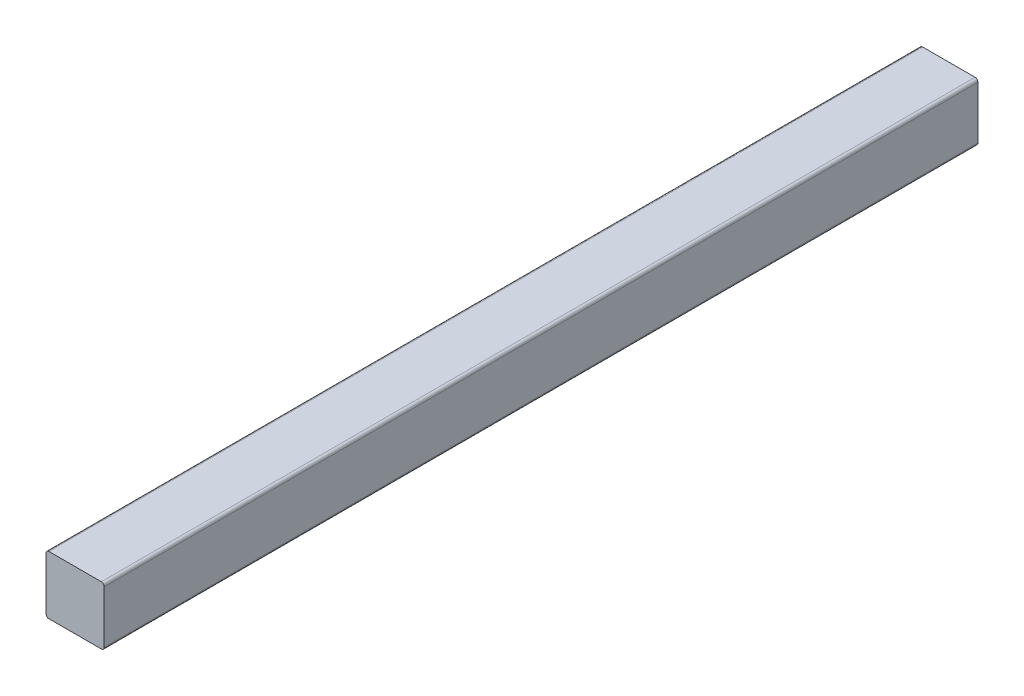
ISO-10303-21;
HEADER;
FILE_DESCRIPTION(('STEP AP214'),'2;1');
FILE_NAME('part.step','',(''),(''),'','','');
FILE_SCHEMA(('AUTOMOTIVE_DESIGN { 1 0 10303 214 1 1 1 1 }'));
ENDSEC;
DATA;
#1=APPLICATION_CONTEXT('core data for automotive mechanical design processes');
#2=APPLICATION_PROTOCOL_DEFINITION('international standard','automotive_design',2000,#1);
#3=PRODUCT_CONTEXT('',#1,'mechanical');
#4=PRODUCT('Part','Part','',(#3));
#5=PRODUCT_RELATED_PRODUCT_CATEGORY('part','',(#4));
#6=PRODUCT_DEFINITION_FORMATION('','',#4);
#7=PRODUCT_DEFINITION_CONTEXT('part definition',#1,'design');
#8=PRODUCT_DEFINITION('design','',#6,#7);
#9=PRODUCT_DEFINITION_SHAPE('','',#8);
#10=(LENGTH_UNIT() NAMED_UNIT(*) SI_UNIT(.MILLI.,.METRE.));
#11=(NAMED_UNIT(*) PLANE_ANGLE_UNIT() SI_UNIT($,.RADIAN.));
#12=(NAMED_UNIT(*) SI_UNIT($,.STERADIAN.) SOLID_ANGLE_UNIT());
#13=UNCERTAINTY_MEASURE_WITH_UNIT(LENGTH_MEASURE(1.E-05),#10,'distance_accuracy_value','');
#14=(GEOMETRIC_REPRESENTATION_CONTEXT(3) GLOBAL_UNCERTAINTY_ASSIGNED_CONTEXT((#13)) GLOBAL_UNIT_ASSIGNED_CONTEXT((#10,
#11,#12)) REPRESENTATION_CONTEXT('',''));
#15=CARTESIAN_POINT('',(0.,0.,0.));
#16=DIRECTION('',(0.,0.,1.));
#17=DIRECTION('',(1.,0.,0.));
#18=AXIS2_PLACEMENT_3D('',#15,#16,#17);
#19=CARTESIAN_POINT('',(19.,1.,300.));
#20=DIRECTION('',(0.,0.,-1.));
#21=DIRECTION('',(-1.,0.,0.));
#22=AXIS2_PLACEMENT_3D('',#19,#20,#21);
#23=CYLINDRICAL_SURFACE('',#22,1.);
#24=CARTESIAN_POINT('',(19.,1.,0.));
#25=DIRECTION('',(0.,0.,1.));
#26=DIRECTION('',(1.,0.,0.));
#27=AXIS2_PLACEMENT_3D('',#24,#25,#26);
#28=CIRCLE('',#27,1.);
#29=CARTESIAN_POINT('',(19.,0.,0.));
#30=VERTEX_POINT('',#29);
#31=CARTESIAN_POINT('',(20.,1.00000000000001,0.));
#32=VERTEX_POINT('',#31);
#33=EDGE_CURVE('E129',#30,#32,#28,.T.);
#34=ORIENTED_EDGE('',*,*,#33,.T.);
#35=DIRECTION('',(0.,0.,-1.));
#36=VECTOR('',#35,1.);
#37=CARTESIAN_POINT('',(20.,1.00000000000001,300.));
#38=LINE('',#37,#36);
#39=CARTESIAN_POINT('',(20.,1.00000000000001,300.));
#40=VERTEX_POINT('',#39);
#41=EDGE_CURVE('E11',#40,#32,#38,.T.);
#42=ORIENTED_EDGE('',*,*,#41,.F.);
#43=CARTESIAN_POINT('',(19.,1.,300.));
#44=DIRECTION('',(0.,0.,1.));
#45=DIRECTION('',(1.,0.,0.));
#46=AXIS2_PLACEMENT_3D('',#43,#44,#45);
#47=CIRCLE('',#46,1.);
#48=CARTESIAN_POINT('',(19.,0.,300.));
#49=VERTEX_POINT('',#48);
#50=EDGE_CURVE('E143',#49,#40,#47,.T.);
#51=ORIENTED_EDGE('',*,*,#50,.F.);
#52=DIRECTION('',(0.,0.,-1.));
#53=VECTOR('',#52,1.);
#54=CARTESIAN_POINT('',(19.,0.,300.));
#55=LINE('',#54,#53);
#56=EDGE_CURVE('E125',#49,#30,#55,.T.);
#57=ORIENTED_EDGE('',*,*,#56,.T.);
#58=EDGE_LOOP('',(#34,#42,#51,#57));
#59=FACE_BOUND('',#58,.T.);
#60=ADVANCED_FACE('F33',(#59),#23,.T.);
#61=CARTESIAN_POINT('',(20.,1.00000000000001,300.));
#62=DIRECTION('',(-1.,0.,0.));
#63=DIRECTION('',(0.,0.,1.));
#64=AXIS2_PLACEMENT_3D('',#61,#62,#63);
#65=PLANE('',#64);
#66=DIRECTION('',(0.,1.,0.));
#67=VECTOR('',#66,1.);
#68=CARTESIAN_POINT('',(20.,1.00000000000001,0.));
#69=LINE('',#68,#67);
#70=CARTESIAN_POINT('',(20.,19.,0.));
#71=VERTEX_POINT('',#70);
#72=EDGE_CURVE('E132',#32,#71,#69,.T.);
#73=ORIENTED_EDGE('',*,*,#72,.T.);
#74=DIRECTION('',(0.,0.,-1.));
#75=VECTOR('',#74,1.);
#76=CARTESIAN_POINT('',(20.,19.,300.));
#77=LINE('',#76,#75);
#78=CARTESIAN_POINT('',(20.,19.,300.));
#79=VERTEX_POINT('',#78);
#80=EDGE_CURVE('E41',#79,#71,#77,.T.);
#81=ORIENTED_EDGE('',*,*,#80,.F.);
#82=DIRECTION('',(0.,1.,0.));
#83=VECTOR('',#82,1.);
#84=CARTESIAN_POINT('',(20.,1.00000000000001,300.));
#85=LINE('',#84,#83);
#86=EDGE_CURVE('E92',#40,#79,#85,.T.);
#87=ORIENTED_EDGE('',*,*,#86,.F.);
#88=ORIENTED_EDGE('',*,*,#41,.T.);
#89=EDGE_LOOP('',(#73,#81,#87,#88));
#90=FACE_BOUND('',#89,.T.);
#91=ADVANCED_FACE('F178',(#90),#65,.F.);
#92=CARTESIAN_POINT('',(19.,19.,300.));
#93=DIRECTION('',(0.,0.,-1.));
#94=DIRECTION('',(-1.,0.,0.));
#95=AXIS2_PLACEMENT_3D('',#92,#93,#94);
#96=CYLINDRICAL_SURFACE('',#95,1.);
#97=CARTESIAN_POINT('',(19.,19.,0.));
#98=DIRECTION('',(0.,0.,1.));
#99=DIRECTION('',(-1.,0.,0.));
#100=AXIS2_PLACEMENT_3D('',#97,#98,#99);
#101=CIRCLE('',#100,1.);
#102=CARTESIAN_POINT('',(19.,20.,0.));
#103=VERTEX_POINT('',#102);
#104=EDGE_CURVE('E134',#71,#103,#101,.T.);
#105=ORIENTED_EDGE('',*,*,#104,.T.);
#106=DIRECTION('',(0.,0.,-1.));
#107=VECTOR('',#106,1.);
#108=CARTESIAN_POINT('',(19.,20.,300.));
#109=LINE('',#108,#107);
#110=CARTESIAN_POINT('',(19.,20.,300.));
#111=VERTEX_POINT('',#110);
#112=EDGE_CURVE('E150',#111,#103,#109,.T.);
#113=ORIENTED_EDGE('',*,*,#112,.F.);
#114=CARTESIAN_POINT('',(19.,19.,300.));
#115=DIRECTION('',(0.,0.,1.));
#116=DIRECTION('',(-1.,0.,0.));
#117=AXIS2_PLACEMENT_3D('',#114,#115,#116);
#118=CIRCLE('',#117,1.);
#119=EDGE_CURVE('E158',#79,#111,#118,.T.);
#120=ORIENTED_EDGE('',*,*,#119,.F.);
#121=ORIENTED_EDGE('',*,*,#80,.T.);
#122=EDGE_LOOP('',(#105,#113,#120,#121));
#123=FACE_BOUND('',#122,.T.);
#124=ADVANCED_FACE('F156',(#123),#96,.T.);
#125=CARTESIAN_POINT('',(1.00000000000001,20.,300.));
#126=DIRECTION('',(0.,-1.,0.));
#127=DIRECTION('',(0.,0.,-1.));
#128=AXIS2_PLACEMENT_3D('',#125,#126,#127);
#129=PLANE('',#128);
#130=DIRECTION('',(-1.,0.,0.));
#131=VECTOR('',#130,1.);
#132=CARTESIAN_POINT('',(1.00000000000001,20.,0.));
#133=LINE('',#132,#131);
#134=CARTESIAN_POINT('',(1.00000000000001,20.,0.));
#135=VERTEX_POINT('',#134);
#136=EDGE_CURVE('E136',#103,#135,#133,.T.);
#137=ORIENTED_EDGE('',*,*,#136,.T.);
#138=DIRECTION('',(0.,0.,-1.));
#139=VECTOR('',#138,1.);
#140=CARTESIAN_POINT('',(1.00000000000001,20.,300.));
#141=LINE('',#140,#139);
#142=CARTESIAN_POINT('',(1.00000000000001,20.,300.));
#143=VERTEX_POINT('',#142);
#144=EDGE_CURVE('E147',#143,#135,#141,.T.);
#145=ORIENTED_EDGE('',*,*,#144,.F.);
#146=DIRECTION('',(-1.,0.,0.));
#147=VECTOR('',#146,1.);
#148=CARTESIAN_POINT('',(1.00000000000001,20.,300.));
#149=LINE('',#148,#147);
#150=EDGE_CURVE('E170',#111,#143,#149,.T.);
#151=ORIENTED_EDGE('',*,*,#150,.F.);
#152=ORIENTED_EDGE('',*,*,#112,.T.);
#153=EDGE_LOOP('',(#137,#145,#151,#152));
#154=FACE_BOUND('',#153,.T.);
#155=ADVANCED_FACE('F166',(#154),#129,.F.);
#156=CARTESIAN_POINT('',(1.,19.,300.));
#157=DIRECTION('',(0.,0.,-1.));
#158=DIRECTION('',(-1.,0.,0.));
#159=AXIS2_PLACEMENT_3D('',#156,#157,#158);
#160=CYLINDRICAL_SURFACE('',#159,1.);
#161=CARTESIAN_POINT('',(1.,19.,0.));
#162=DIRECTION('',(0.,0.,1.));
#163=DIRECTION('',(-1.,0.,0.));
#164=AXIS2_PLACEMENT_3D('',#161,#162,#163);
#165=CIRCLE('',#164,1.);
#166=CARTESIAN_POINT('',(0.,19.,0.));
#167=VERTEX_POINT('',#166);
#168=EDGE_CURVE('E138',#135,#167,#165,.T.);
#169=ORIENTED_EDGE('',*,*,#168,.T.);
#170=DIRECTION('',(0.,0.,-1.));
#171=VECTOR('',#170,1.);
#172=CARTESIAN_POINT('',(0.,19.,300.));
#173=LINE('',#172,#171);
#174=CARTESIAN_POINT('',(0.,19.,300.));
#175=VERTEX_POINT('',#174);
#176=EDGE_CURVE('E120',#175,#167,#173,.T.);
#177=ORIENTED_EDGE('',*,*,#176,.F.);
#178=CARTESIAN_POINT('',(1.,19.,300.));
#179=DIRECTION('',(0.,0.,1.));
#180=DIRECTION('',(-1.,0.,0.));
#181=AXIS2_PLACEMENT_3D('',#178,#179,#180);
#182=CIRCLE('',#181,1.);
#183=EDGE_CURVE('E111',#143,#175,#182,.T.);
#184=ORIENTED_EDGE('',*,*,#183,.F.);
#185=ORIENTED_EDGE('',*,*,#144,.T.);
#186=EDGE_LOOP('',(#169,#177,#184,#185));
#187=FACE_BOUND('',#186,.T.);
#188=ADVANCED_FACE('F169',(#187),#160,.T.);
#189=CARTESIAN_POINT('',(0.,1.00000000000001,300.));
#190=DIRECTION('',(1.,0.,0.));
#191=DIRECTION('',(0.,0.,-1.));
#192=AXIS2_PLACEMENT_3D('',#189,#190,#191);
#193=PLANE('',#192);
#194=DIRECTION('',(0.,-1.,0.));
#195=VECTOR('',#194,1.);
#196=CARTESIAN_POINT('',(0.,1.00000000000001,0.));
#197=LINE('',#196,#195);
#198=CARTESIAN_POINT('',(0.,1.,0.));
#199=VERTEX_POINT('',#198);
#200=EDGE_CURVE('E119',#167,#199,#197,.T.);
#201=ORIENTED_EDGE('',*,*,#200,.T.);
#202=DIRECTION('',(0.,0.,-1.));
#203=VECTOR('',#202,1.);
#204=CARTESIAN_POINT('',(0.,1.,300.));
#205=LINE('',#204,#203);
#206=CARTESIAN_POINT('',(0.,1.,300.));
#207=VERTEX_POINT('',#206);
#208=EDGE_CURVE('E116',#207,#199,#205,.T.);
#209=ORIENTED_EDGE('',*,*,#208,.F.);
#210=DIRECTION('',(0.,-1.,0.));
#211=VECTOR('',#210,1.);
#212=CARTESIAN_POINT('',(0.,1.00000000000001,300.));
#213=LINE('',#212,#211);
#214=EDGE_CURVE('E105',#175,#207,#213,.T.);
#215=ORIENTED_EDGE('',*,*,#214,.F.);
#216=ORIENTED_EDGE('',*,*,#176,.T.);
#217=EDGE_LOOP('',(#201,#209,#215,#216));
#218=FACE_BOUND('',#217,.T.);
#219=ADVANCED_FACE('F117',(#218),#193,.F.);
#220=CARTESIAN_POINT('',(1.,1.,300.));
#221=DIRECTION('',(0.,0.,-1.));
#222=DIRECTION('',(-1.,0.,0.));
#223=AXIS2_PLACEMENT_3D('',#220,#221,#222);
#224=CYLINDRICAL_SURFACE('',#223,1.);
#225=CARTESIAN_POINT('',(1.,1.,0.));
#226=DIRECTION('',(0.,0.,1.));
#227=DIRECTION('',(-1.,0.,0.));
#228=AXIS2_PLACEMENT_3D('',#225,#226,#227);
#229=CIRCLE('',#228,1.);
#230=CARTESIAN_POINT('',(1.00000000000001,0.,0.));
#231=VERTEX_POINT('',#230);
#232=EDGE_CURVE('E78',#199,#231,#229,.T.);
#233=ORIENTED_EDGE('',*,*,#232,.T.);
#234=DIRECTION('',(0.,0.,-1.));
#235=VECTOR('',#234,1.);
#236=CARTESIAN_POINT('',(1.00000000000001,0.,300.));
#237=LINE('',#236,#235);
#238=CARTESIAN_POINT('',(1.00000000000001,0.,300.));
#239=VERTEX_POINT('',#238);
#240=EDGE_CURVE('E121',#239,#231,#237,.T.);
#241=ORIENTED_EDGE('',*,*,#240,.F.);
#242=CARTESIAN_POINT('',(1.,1.,300.));
#243=DIRECTION('',(0.,0.,1.));
#244=DIRECTION('',(-1.,0.,0.));
#245=AXIS2_PLACEMENT_3D('',#242,#243,#244);
#246=CIRCLE('',#245,1.);
#247=EDGE_CURVE('E109',#207,#239,#246,.T.);
#248=ORIENTED_EDGE('',*,*,#247,.F.);
#249=ORIENTED_EDGE('',*,*,#208,.T.);
#250=EDGE_LOOP('',(#233,#241,#248,#249));
#251=FACE_BOUND('',#250,.T.);
#252=ADVANCED_FACE('F123',(#251),#224,.T.);
#253=CARTESIAN_POINT('',(1.00000000000001,0.,300.));
#254=DIRECTION('',(0.,1.,0.));
#255=DIRECTION('',(0.,0.,1.));
#256=AXIS2_PLACEMENT_3D('',#253,#254,#255);
#257=PLANE('',#256);
#258=DIRECTION('',(1.,0.,0.));
#259=VECTOR('',#258,1.);
#260=CARTESIAN_POINT('',(1.00000000000001,0.,0.));
#261=LINE('',#260,#259);
#262=EDGE_CURVE('E84',#231,#30,#261,.T.);
#263=ORIENTED_EDGE('',*,*,#262,.T.);
#264=ORIENTED_EDGE('',*,*,#56,.F.);
#265=DIRECTION('',(1.,0.,0.));
#266=VECTOR('',#265,1.);
#267=CARTESIAN_POINT('',(1.00000000000001,0.,300.));
#268=LINE('',#267,#266);
#269=EDGE_CURVE('E49',#239,#49,#268,.T.);
#270=ORIENTED_EDGE('',*,*,#269,.F.);
#271=ORIENTED_EDGE('',*,*,#240,.T.);
#272=EDGE_LOOP('',(#263,#264,#270,#271));
#273=FACE_BOUND('',#272,.T.);
#274=ADVANCED_FACE('F194',(#273),#257,.F.);
#275=CARTESIAN_POINT('',(19.,1.,300.));
#276=DIRECTION('',(0.,0.,1.));
#277=DIRECTION('',(1.,0.,0.));
#278=AXIS2_PLACEMENT_3D('',#275,#276,#277);
#279=PLANE('',#278);
#280=ORIENTED_EDGE('',*,*,#50,.T.);
#281=ORIENTED_EDGE('',*,*,#86,.T.);
#282=ORIENTED_EDGE('',*,*,#119,.T.);
#283=ORIENTED_EDGE('',*,*,#150,.T.);
#284=ORIENTED_EDGE('',*,*,#183,.T.);
#285=ORIENTED_EDGE('',*,*,#214,.T.);
#286=ORIENTED_EDGE('',*,*,#247,.T.);
#287=ORIENTED_EDGE('',*,*,#269,.T.);
#288=EDGE_LOOP('',(#280,#281,#282,#283,#284,#285,#286,#287));
#289=FACE_BOUND('',#288,.T.);
#290=ADVANCED_FACE('F107',(#289),#279,.T.);
#291=CARTESIAN_POINT('',(19.,1.,0.));
#292=DIRECTION('',(0.,0.,1.));
#293=DIRECTION('',(1.,0.,0.));
#294=AXIS2_PLACEMENT_3D('',#291,#292,#293);
#295=PLANE('',#294);
#296=ORIENTED_EDGE('',*,*,#33,.F.);
#297=ORIENTED_EDGE('',*,*,#262,.F.);
#298=ORIENTED_EDGE('',*,*,#232,.F.);
#299=ORIENTED_EDGE('',*,*,#200,.F.);
#300=ORIENTED_EDGE('',*,*,#168,.F.);
#301=ORIENTED_EDGE('',*,*,#136,.F.);
#302=ORIENTED_EDGE('',*,*,#104,.F.);
#303=ORIENTED_EDGE('',*,*,#72,.F.);
#304=EDGE_LOOP('',(#296,#297,#298,#299,#300,#301,#302,#303));
#305=FACE_BOUND('',#304,.T.);
#306=ADVANCED_FACE('F162',(#305),#295,.F.);
#307=CLOSED_SHELL('',(#60,#91,#124,#155,#188,#219,#252,#274,#290,#306));
#308=MANIFOLD_SOLID_BREP('B2',#307);
#309=ADVANCED_BREP_SHAPE_REPRESENTATION('',(#18,#308),#14);
#310=SHAPE_DEFINITION_REPRESENTATION(#9,#309);
ENDSEC;
END-ISO-10303-21;
